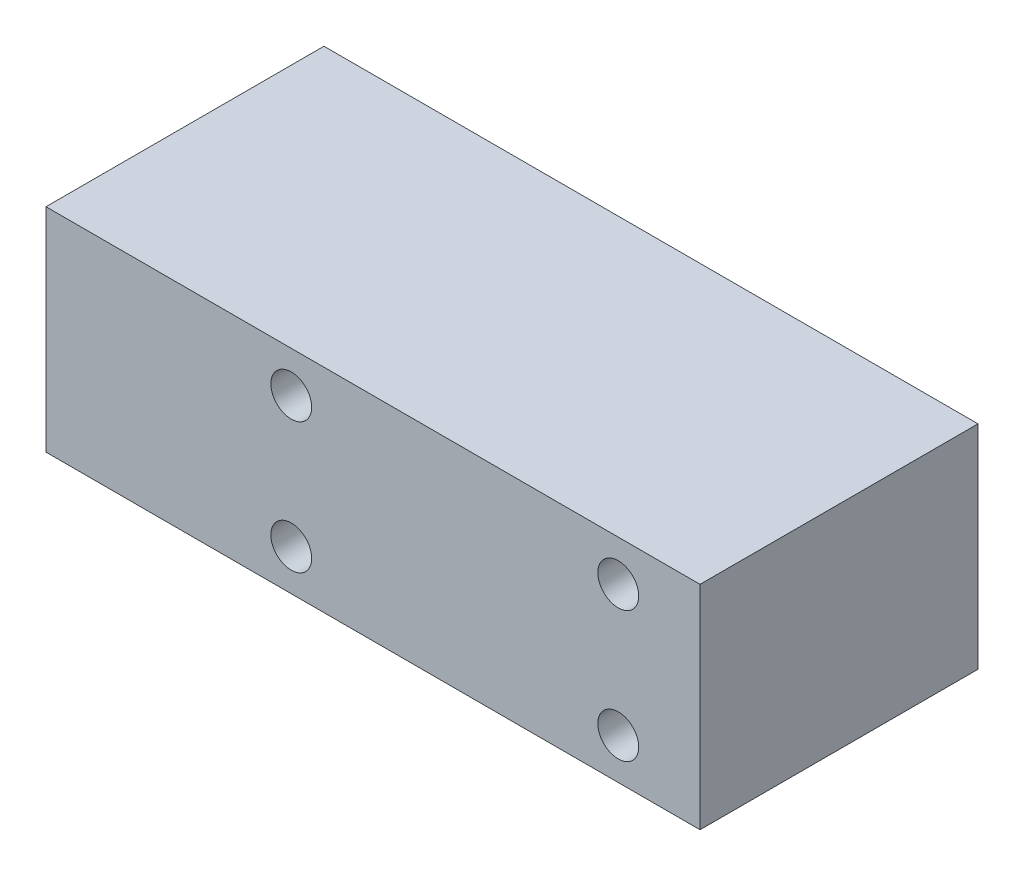
ISO-10303-21;
HEADER;
FILE_DESCRIPTION(('STEP AP214'),'2;1');
FILE_NAME('part.step','',(''),(''),'','','');
FILE_SCHEMA(('AUTOMOTIVE_DESIGN { 1 0 10303 214 1 1 1 1 }'));
ENDSEC;
DATA;
#1=APPLICATION_CONTEXT('core data for automotive mechanical design processes');
#2=APPLICATION_PROTOCOL_DEFINITION('international standard','automotive_design',2000,#1);
#3=PRODUCT_CONTEXT('',#1,'mechanical');
#4=PRODUCT('Part','Part','',(#3));
#5=PRODUCT_RELATED_PRODUCT_CATEGORY('part','',(#4));
#6=PRODUCT_DEFINITION_FORMATION('','',#4);
#7=PRODUCT_DEFINITION_CONTEXT('part definition',#1,'design');
#8=PRODUCT_DEFINITION('design','',#6,#7);
#9=PRODUCT_DEFINITION_SHAPE('','',#8);
#10=(LENGTH_UNIT() NAMED_UNIT(*) SI_UNIT(.MILLI.,.METRE.));
#11=(NAMED_UNIT(*) PLANE_ANGLE_UNIT() SI_UNIT($,.RADIAN.));
#12=(NAMED_UNIT(*) SI_UNIT($,.STERADIAN.) SOLID_ANGLE_UNIT());
#13=UNCERTAINTY_MEASURE_WITH_UNIT(LENGTH_MEASURE(1.E-05),#10,'distance_accuracy_value','');
#14=(GEOMETRIC_REPRESENTATION_CONTEXT(3) GLOBAL_UNCERTAINTY_ASSIGNED_CONTEXT((#13)) GLOBAL_UNIT_ASSIGNED_CONTEXT((#10,
#11,#12)) REPRESENTATION_CONTEXT('',''));
#15=CARTESIAN_POINT('',(0.,0.,0.));
#16=DIRECTION('',(0.,0.,1.));
#17=DIRECTION('',(1.,0.,0.));
#18=AXIS2_PLACEMENT_3D('',#15,#16,#17);
#19=CARTESIAN_POINT('',(0.,0.,34.));
#20=DIRECTION('',(1.,0.,0.));
#21=DIRECTION('',(0.,0.,-1.));
#22=AXIS2_PLACEMENT_3D('',#19,#20,#21);
#23=PLANE('',#22);
#24=DIRECTION('',(0.,-1.,0.));
#25=VECTOR('',#24,1.);
#26=CARTESIAN_POINT('',(0.,0.,0.));
#27=LINE('',#26,#25);
#28=CARTESIAN_POINT('',(0.,26.,0.));
#29=VERTEX_POINT('',#28);
#30=CARTESIAN_POINT('',(0.,0.,0.));
#31=VERTEX_POINT('',#30);
#32=EDGE_CURVE('E164',#29,#31,#27,.T.);
#33=ORIENTED_EDGE('',*,*,#32,.T.);
#34=DIRECTION('',(0.,0.,-1.));
#35=VECTOR('',#34,1.);
#36=CARTESIAN_POINT('',(0.,0.,34.));
#37=LINE('',#36,#35);
#38=CARTESIAN_POINT('',(0.,0.,34.));
#39=VERTEX_POINT('',#38);
#40=EDGE_CURVE('E11',#39,#31,#37,.T.);
#41=ORIENTED_EDGE('',*,*,#40,.F.);
#42=DIRECTION('',(0.,-1.,0.));
#43=VECTOR('',#42,1.);
#44=CARTESIAN_POINT('',(0.,0.,34.));
#45=LINE('',#44,#43);
#46=CARTESIAN_POINT('',(0.,26.,34.));
#47=VERTEX_POINT('',#46);
#48=EDGE_CURVE('E165',#47,#39,#45,.T.);
#49=ORIENTED_EDGE('',*,*,#48,.F.);
#50=DIRECTION('',(0.,0.,-1.));
#51=VECTOR('',#50,1.);
#52=CARTESIAN_POINT('',(0.,26.,34.));
#53=LINE('',#52,#51);
#54=EDGE_CURVE('E171',#47,#29,#53,.T.);
#55=ORIENTED_EDGE('',*,*,#54,.T.);
#56=EDGE_LOOP('',(#33,#41,#49,#55));
#57=FACE_BOUND('',#56,.T.);
#58=ADVANCED_FACE('F35',(#57),#23,.F.);
#59=CARTESIAN_POINT('',(0.,0.,34.));
#60=DIRECTION('',(0.,1.,0.));
#61=DIRECTION('',(0.,0.,1.));
#62=AXIS2_PLACEMENT_3D('',#59,#60,#61);
#63=PLANE('',#62);
#64=DIRECTION('',(1.,0.,0.));
#65=VECTOR('',#64,1.);
#66=CARTESIAN_POINT('',(0.,0.,0.));
#67=LINE('',#66,#65);
#68=CARTESIAN_POINT('',(80.,0.,0.));
#69=VERTEX_POINT('',#68);
#70=EDGE_CURVE('E174',#31,#69,#67,.T.);
#71=ORIENTED_EDGE('',*,*,#70,.T.);
#72=DIRECTION('',(0.,0.,-1.));
#73=VECTOR('',#72,1.);
#74=CARTESIAN_POINT('',(80.,0.,34.));
#75=LINE('',#74,#73);
#76=CARTESIAN_POINT('',(80.,0.,34.));
#77=VERTEX_POINT('',#76);
#78=EDGE_CURVE('E43',#77,#69,#75,.T.);
#79=ORIENTED_EDGE('',*,*,#78,.F.);
#80=DIRECTION('',(1.,0.,0.));
#81=VECTOR('',#80,1.);
#82=CARTESIAN_POINT('',(0.,0.,34.));
#83=LINE('',#82,#81);
#84=EDGE_CURVE('E82',#39,#77,#83,.T.);
#85=ORIENTED_EDGE('',*,*,#84,.F.);
#86=ORIENTED_EDGE('',*,*,#40,.T.);
#87=EDGE_LOOP('',(#71,#79,#85,#86));
#88=FACE_BOUND('',#87,.T.);
#89=ADVANCED_FACE('F198',(#88),#63,.F.);
#90=CARTESIAN_POINT('',(80.,0.,34.));
#91=DIRECTION('',(-1.,0.,0.));
#92=DIRECTION('',(0.,0.,1.));
#93=AXIS2_PLACEMENT_3D('',#90,#91,#92);
#94=PLANE('',#93);
#95=DIRECTION('',(0.,1.,0.));
#96=VECTOR('',#95,1.);
#97=CARTESIAN_POINT('',(80.,0.,0.));
#98=LINE('',#97,#96);
#99=CARTESIAN_POINT('',(80.,26.,0.));
#100=VERTEX_POINT('',#99);
#101=EDGE_CURVE('E69',#69,#100,#98,.T.);
#102=ORIENTED_EDGE('',*,*,#101,.T.);
#103=DIRECTION('',(0.,0.,-1.));
#104=VECTOR('',#103,1.);
#105=CARTESIAN_POINT('',(80.,26.,34.));
#106=LINE('',#105,#104);
#107=CARTESIAN_POINT('',(80.,26.,34.));
#108=VERTEX_POINT('',#107);
#109=EDGE_CURVE('E179',#108,#100,#106,.T.);
#110=ORIENTED_EDGE('',*,*,#109,.F.);
#111=DIRECTION('',(0.,1.,0.));
#112=VECTOR('',#111,1.);
#113=CARTESIAN_POINT('',(80.,0.,34.));
#114=LINE('',#113,#112);
#115=EDGE_CURVE('E168',#77,#108,#114,.T.);
#116=ORIENTED_EDGE('',*,*,#115,.F.);
#117=ORIENTED_EDGE('',*,*,#78,.T.);
#118=EDGE_LOOP('',(#102,#110,#116,#117));
#119=FACE_BOUND('',#118,.T.);
#120=ADVANCED_FACE('F181',(#119),#94,.F.);
#121=CARTESIAN_POINT('',(0.,26.,34.));
#122=DIRECTION('',(0.,-1.,0.));
#123=DIRECTION('',(0.,0.,-1.));
#124=AXIS2_PLACEMENT_3D('',#121,#122,#123);
#125=PLANE('',#124);
#126=DIRECTION('',(-1.,0.,0.));
#127=VECTOR('',#126,1.);
#128=CARTESIAN_POINT('',(0.,26.,0.));
#129=LINE('',#128,#127);
#130=EDGE_CURVE('E75',#100,#29,#129,.T.);
#131=ORIENTED_EDGE('',*,*,#130,.T.);
#132=ORIENTED_EDGE('',*,*,#54,.F.);
#133=DIRECTION('',(-1.,0.,0.));
#134=VECTOR('',#133,1.);
#135=CARTESIAN_POINT('',(0.,26.,34.));
#136=LINE('',#135,#134);
#137=EDGE_CURVE('E51',#108,#47,#136,.T.);
#138=ORIENTED_EDGE('',*,*,#137,.F.);
#139=ORIENTED_EDGE('',*,*,#109,.T.);
#140=EDGE_LOOP('',(#131,#132,#138,#139));
#141=FACE_BOUND('',#140,.T.);
#142=ADVANCED_FACE('F188',(#141),#125,.F.);
#143=CARTESIAN_POINT('',(0.,26.,34.));
#144=DIRECTION('',(0.,0.,-1.));
#145=DIRECTION('',(-1.,0.,0.));
#146=AXIS2_PLACEMENT_3D('',#143,#144,#145);
#147=PLANE('',#146);
#148=CARTESIAN_POINT('',(70.,21.,34.));
#149=DIRECTION('',(0.,0.,1.));
#150=DIRECTION('',(1.,0.,0.));
#151=AXIS2_PLACEMENT_3D('',#148,#149,#150);
#152=CIRCLE('',#151,2.49999999999999);
#153=CARTESIAN_POINT('',(72.5,21.,34.));
#154=VERTEX_POINT('',#153);
#155=EDGE_CURVE('E140',#154,#154,#152,.T.);
#156=ORIENTED_EDGE('',*,*,#155,.F.);
#157=EDGE_LOOP('',(#156));
#158=FACE_BOUND('',#157,.T.);
#159=CARTESIAN_POINT('',(70.,5.,34.));
#160=DIRECTION('',(0.,0.,1.));
#161=DIRECTION('',(1.,0.,0.));
#162=AXIS2_PLACEMENT_3D('',#159,#160,#161);
#163=CIRCLE('',#162,2.49999999999999);
#164=CARTESIAN_POINT('',(72.5,5.,34.));
#165=VERTEX_POINT('',#164);
#166=EDGE_CURVE('E146',#165,#165,#163,.T.);
#167=ORIENTED_EDGE('',*,*,#166,.F.);
#168=EDGE_LOOP('',(#167));
#169=FACE_BOUND('',#168,.T.);
#170=CARTESIAN_POINT('',(30.,21.,34.));
#171=DIRECTION('',(0.,0.,1.));
#172=DIRECTION('',(1.,0.,0.));
#173=AXIS2_PLACEMENT_3D('',#170,#171,#172);
#174=CIRCLE('',#173,2.49999999999999);
#175=CARTESIAN_POINT('',(32.5,21.,34.));
#176=VERTEX_POINT('',#175);
#177=EDGE_CURVE('E152',#176,#176,#174,.T.);
#178=ORIENTED_EDGE('',*,*,#177,.F.);
#179=EDGE_LOOP('',(#178));
#180=FACE_BOUND('',#179,.T.);
#181=CARTESIAN_POINT('',(30.,5.,34.));
#182=DIRECTION('',(0.,0.,1.));
#183=DIRECTION('',(1.,0.,0.));
#184=AXIS2_PLACEMENT_3D('',#181,#182,#183);
#185=CIRCLE('',#184,2.49999999999999);
#186=CARTESIAN_POINT('',(32.5,5.,34.));
#187=VERTEX_POINT('',#186);
#188=EDGE_CURVE('E158',#187,#187,#185,.T.);
#189=ORIENTED_EDGE('',*,*,#188,.F.);
#190=EDGE_LOOP('',(#189));
#191=FACE_BOUND('',#190,.T.);
#192=ORIENTED_EDGE('',*,*,#48,.T.);
#193=ORIENTED_EDGE('',*,*,#84,.T.);
#194=ORIENTED_EDGE('',*,*,#115,.T.);
#195=ORIENTED_EDGE('',*,*,#137,.T.);
#196=EDGE_LOOP('',(#192,#193,#194,#195));
#197=FACE_BOUND('',#196,.T.);
#198=ADVANCED_FACE('F190',(#158,#169,#180,#191,#197),#147,.F.);
#199=CARTESIAN_POINT('',(0.,26.,0.));
#200=DIRECTION('',(0.,0.,-1.));
#201=DIRECTION('',(-1.,0.,0.));
#202=AXIS2_PLACEMENT_3D('',#199,#200,#201);
#203=PLANE('',#202);
#204=CARTESIAN_POINT('',(10.,5.,0.));
#205=DIRECTION('',(0.,0.,-1.));
#206=DIRECTION('',(-1.,0.,0.));
#207=AXIS2_PLACEMENT_3D('',#204,#205,#206);
#208=CIRCLE('',#207,2.49999999999999);
#209=CARTESIAN_POINT('',(7.50000000000002,5.,0.));
#210=VERTEX_POINT('',#209);
#211=EDGE_CURVE('E118',#210,#210,#208,.T.);
#212=ORIENTED_EDGE('',*,*,#211,.F.);
#213=EDGE_LOOP('',(#212));
#214=FACE_BOUND('',#213,.T.);
#215=CARTESIAN_POINT('',(10.,21.,0.));
#216=DIRECTION('',(0.,0.,-1.));
#217=DIRECTION('',(-1.,0.,0.));
#218=AXIS2_PLACEMENT_3D('',#215,#216,#217);
#219=CIRCLE('',#218,2.49999999999999);
#220=CARTESIAN_POINT('',(7.50000000000002,21.,0.));
#221=VERTEX_POINT('',#220);
#222=EDGE_CURVE('E117',#221,#221,#219,.T.);
#223=ORIENTED_EDGE('',*,*,#222,.F.);
#224=EDGE_LOOP('',(#223));
#225=FACE_BOUND('',#224,.T.);
#226=CARTESIAN_POINT('',(70.,21.,0.));
#227=DIRECTION('',(0.,0.,-1.));
#228=DIRECTION('',(-1.,0.,0.));
#229=AXIS2_PLACEMENT_3D('',#226,#227,#228);
#230=CIRCLE('',#229,2.49999999999999);
#231=CARTESIAN_POINT('',(67.5,21.,0.));
#232=VERTEX_POINT('',#231);
#233=EDGE_CURVE('E128',#232,#232,#230,.T.);
#234=ORIENTED_EDGE('',*,*,#233,.F.);
#235=EDGE_LOOP('',(#234));
#236=FACE_BOUND('',#235,.T.);
#237=CARTESIAN_POINT('',(70.,5.,0.));
#238=DIRECTION('',(0.,0.,-1.));
#239=DIRECTION('',(-1.,0.,0.));
#240=AXIS2_PLACEMENT_3D('',#237,#238,#239);
#241=CIRCLE('',#240,2.49999999999999);
#242=CARTESIAN_POINT('',(67.5,5.,0.));
#243=VERTEX_POINT('',#242);
#244=EDGE_CURVE('E134',#243,#243,#241,.T.);
#245=ORIENTED_EDGE('',*,*,#244,.F.);
#246=EDGE_LOOP('',(#245));
#247=FACE_BOUND('',#246,.T.);
#248=ORIENTED_EDGE('',*,*,#32,.F.);
#249=ORIENTED_EDGE('',*,*,#130,.F.);
#250=ORIENTED_EDGE('',*,*,#101,.F.);
#251=ORIENTED_EDGE('',*,*,#70,.F.);
#252=EDGE_LOOP('',(#248,#249,#250,#251));
#253=FACE_BOUND('',#252,.T.);
#254=ADVANCED_FACE('F184',(#214,#225,#236,#247,#253),#203,.T.);
#255=CARTESIAN_POINT('',(30.,5.,19.));
#256=DIRECTION('',(0.,0.,1.));
#257=DIRECTION('',(1.,0.,0.));
#258=AXIS2_PLACEMENT_3D('',#255,#256,#257);
#259=CONICAL_SURFACE('',#258,2.49999999999999,1.02974425867665);
#260=CARTESIAN_POINT('',(30.,5.,17.4978484524311));
#261=VERTEX_POINT('',#260);
#262=VERTEX_LOOP('',#261);
#263=FACE_BOUND('',#262,.T.);
#264=CARTESIAN_POINT('',(30.,5.,19.));
#265=DIRECTION('',(0.,0.,1.));
#266=DIRECTION('',(1.,0.,0.));
#267=AXIS2_PLACEMENT_3D('',#264,#265,#266);
#268=CIRCLE('',#267,2.49999999999999);
#269=CARTESIAN_POINT('',(32.5,5.,19.));
#270=VERTEX_POINT('',#269);
#271=EDGE_CURVE('E161',#270,#270,#268,.T.);
#272=ORIENTED_EDGE('',*,*,#271,.T.);
#273=EDGE_LOOP('',(#272));
#274=FACE_BOUND('',#273,.T.);
#275=ADVANCED_FACE('F228',(#263,#274),#259,.F.);
#276=CARTESIAN_POINT('',(30.,5.,34.));
#277=DIRECTION('',(0.,0.,1.));
#278=DIRECTION('',(1.,0.,0.));
#279=AXIS2_PLACEMENT_3D('',#276,#277,#278);
#280=CYLINDRICAL_SURFACE('',#279,2.49999999999999);
#281=ORIENTED_EDGE('',*,*,#271,.F.);
#282=EDGE_LOOP('',(#281));
#283=FACE_BOUND('',#282,.T.);
#284=ORIENTED_EDGE('',*,*,#188,.T.);
#285=EDGE_LOOP('',(#284));
#286=FACE_BOUND('',#285,.T.);
#287=ADVANCED_FACE('F233',(#283,#286),#280,.F.);
#288=CARTESIAN_POINT('',(30.,21.,19.));
#289=DIRECTION('',(0.,0.,1.));
#290=DIRECTION('',(1.,0.,0.));
#291=AXIS2_PLACEMENT_3D('',#288,#289,#290);
#292=CONICAL_SURFACE('',#291,2.49999999999999,1.02974425867665);
#293=CARTESIAN_POINT('',(30.,21.,17.4978484524311));
#294=VERTEX_POINT('',#293);
#295=VERTEX_LOOP('',#294);
#296=FACE_BOUND('',#295,.T.);
#297=CARTESIAN_POINT('',(30.,21.,19.));
#298=DIRECTION('',(0.,0.,1.));
#299=DIRECTION('',(1.,0.,0.));
#300=AXIS2_PLACEMENT_3D('',#297,#298,#299);
#301=CIRCLE('',#300,2.49999999999999);
#302=CARTESIAN_POINT('',(32.5,21.,19.));
#303=VERTEX_POINT('',#302);
#304=EDGE_CURVE('E155',#303,#303,#301,.T.);
#305=ORIENTED_EDGE('',*,*,#304,.T.);
#306=EDGE_LOOP('',(#305));
#307=FACE_BOUND('',#306,.T.);
#308=ADVANCED_FACE('F244',(#296,#307),#292,.F.);
#309=CARTESIAN_POINT('',(30.,21.,34.));
#310=DIRECTION('',(0.,0.,1.));
#311=DIRECTION('',(1.,0.,0.));
#312=AXIS2_PLACEMENT_3D('',#309,#310,#311);
#313=CYLINDRICAL_SURFACE('',#312,2.49999999999999);
#314=ORIENTED_EDGE('',*,*,#304,.F.);
#315=EDGE_LOOP('',(#314));
#316=FACE_BOUND('',#315,.T.);
#317=ORIENTED_EDGE('',*,*,#177,.T.);
#318=EDGE_LOOP('',(#317));
#319=FACE_BOUND('',#318,.T.);
#320=ADVANCED_FACE('F255',(#316,#319),#313,.F.);
#321=CARTESIAN_POINT('',(70.,5.,19.));
#322=DIRECTION('',(0.,0.,1.));
#323=DIRECTION('',(1.,0.,0.));
#324=AXIS2_PLACEMENT_3D('',#321,#322,#323);
#325=CONICAL_SURFACE('',#324,2.49999999999999,1.02974425867665);
#326=CARTESIAN_POINT('',(70.,5.,17.4978484524311));
#327=VERTEX_POINT('',#326);
#328=VERTEX_LOOP('',#327);
#329=FACE_BOUND('',#328,.T.);
#330=CARTESIAN_POINT('',(70.,5.,19.));
#331=DIRECTION('',(0.,0.,1.));
#332=DIRECTION('',(1.,0.,0.));
#333=AXIS2_PLACEMENT_3D('',#330,#331,#332);
#334=CIRCLE('',#333,2.49999999999999);
#335=CARTESIAN_POINT('',(72.5,5.,19.));
#336=VERTEX_POINT('',#335);
#337=EDGE_CURVE('E149',#336,#336,#334,.T.);
#338=ORIENTED_EDGE('',*,*,#337,.T.);
#339=EDGE_LOOP('',(#338));
#340=FACE_BOUND('',#339,.T.);
#341=ADVANCED_FACE('F265',(#329,#340),#325,.F.);
#342=CARTESIAN_POINT('',(70.,5.,34.));
#343=DIRECTION('',(0.,0.,1.));
#344=DIRECTION('',(1.,0.,0.));
#345=AXIS2_PLACEMENT_3D('',#342,#343,#344);
#346=CYLINDRICAL_SURFACE('',#345,2.49999999999999);
#347=ORIENTED_EDGE('',*,*,#337,.F.);
#348=EDGE_LOOP('',(#347));
#349=FACE_BOUND('',#348,.T.);
#350=ORIENTED_EDGE('',*,*,#166,.T.);
#351=EDGE_LOOP('',(#350));
#352=FACE_BOUND('',#351,.T.);
#353=ADVANCED_FACE('F276',(#349,#352),#346,.F.);
#354=CARTESIAN_POINT('',(70.,21.,19.));
#355=DIRECTION('',(0.,0.,1.));
#356=DIRECTION('',(1.,0.,0.));
#357=AXIS2_PLACEMENT_3D('',#354,#355,#356);
#358=CONICAL_SURFACE('',#357,2.49999999999999,1.02974425867665);
#359=CARTESIAN_POINT('',(70.,21.,17.4978484524311));
#360=VERTEX_POINT('',#359);
#361=VERTEX_LOOP('',#360);
#362=FACE_BOUND('',#361,.T.);
#363=CARTESIAN_POINT('',(70.,21.,19.));
#364=DIRECTION('',(0.,0.,1.));
#365=DIRECTION('',(1.,0.,0.));
#366=AXIS2_PLACEMENT_3D('',#363,#364,#365);
#367=CIRCLE('',#366,2.49999999999999);
#368=CARTESIAN_POINT('',(72.5,21.,19.));
#369=VERTEX_POINT('',#368);
#370=EDGE_CURVE('E143',#369,#369,#367,.T.);
#371=ORIENTED_EDGE('',*,*,#370,.T.);
#372=EDGE_LOOP('',(#371));
#373=FACE_BOUND('',#372,.T.);
#374=ADVANCED_FACE('F286',(#362,#373),#358,.F.);
#375=CARTESIAN_POINT('',(70.,21.,34.));
#376=DIRECTION('',(0.,0.,1.));
#377=DIRECTION('',(1.,0.,0.));
#378=AXIS2_PLACEMENT_3D('',#375,#376,#377);
#379=CYLINDRICAL_SURFACE('',#378,2.49999999999999);
#380=ORIENTED_EDGE('',*,*,#370,.F.);
#381=EDGE_LOOP('',(#380));
#382=FACE_BOUND('',#381,.T.);
#383=ORIENTED_EDGE('',*,*,#155,.T.);
#384=EDGE_LOOP('',(#383));
#385=FACE_BOUND('',#384,.T.);
#386=ADVANCED_FACE('F297',(#382,#385),#379,.F.);
#387=CARTESIAN_POINT('',(70.,5.,15.));
#388=DIRECTION('',(0.,0.,-1.));
#389=DIRECTION('',(-1.,0.,0.));
#390=AXIS2_PLACEMENT_3D('',#387,#388,#389);
#391=CONICAL_SURFACE('',#390,2.5,1.02974425867666);
#392=CARTESIAN_POINT('',(70.,5.,16.5021515475689));
#393=VERTEX_POINT('',#392);
#394=VERTEX_LOOP('',#393);
#395=FACE_BOUND('',#394,.T.);
#396=CARTESIAN_POINT('',(70.,5.,15.));
#397=DIRECTION('',(0.,0.,-1.));
#398=DIRECTION('',(-1.,0.,0.));
#399=AXIS2_PLACEMENT_3D('',#396,#397,#398);
#400=CIRCLE('',#399,2.5);
#401=CARTESIAN_POINT('',(67.5,5.,15.));
#402=VERTEX_POINT('',#401);
#403=EDGE_CURVE('E137',#402,#402,#400,.T.);
#404=ORIENTED_EDGE('',*,*,#403,.T.);
#405=EDGE_LOOP('',(#404));
#406=FACE_BOUND('',#405,.T.);
#407=ADVANCED_FACE('F307',(#395,#406),#391,.F.);
#408=CARTESIAN_POINT('',(70.,5.,0.));
#409=DIRECTION('',(0.,0.,-1.));
#410=DIRECTION('',(-1.,0.,0.));
#411=AXIS2_PLACEMENT_3D('',#408,#409,#410);
#412=CYLINDRICAL_SURFACE('',#411,2.5);
#413=ORIENTED_EDGE('',*,*,#403,.F.);
#414=EDGE_LOOP('',(#413));
#415=FACE_BOUND('',#414,.T.);
#416=ORIENTED_EDGE('',*,*,#244,.T.);
#417=EDGE_LOOP('',(#416));
#418=FACE_BOUND('',#417,.T.);
#419=ADVANCED_FACE('F324',(#415,#418),#412,.F.);
#420=CARTESIAN_POINT('',(70.,21.,15.));
#421=DIRECTION('',(0.,0.,-1.));
#422=DIRECTION('',(-1.,0.,0.));
#423=AXIS2_PLACEMENT_3D('',#420,#421,#422);
#424=CONICAL_SURFACE('',#423,2.5,1.02974425867666);
#425=CARTESIAN_POINT('',(70.,21.,16.5021515475689));
#426=VERTEX_POINT('',#425);
#427=VERTEX_LOOP('',#426);
#428=FACE_BOUND('',#427,.T.);
#429=CARTESIAN_POINT('',(70.,21.,15.));
#430=DIRECTION('',(0.,0.,-1.));
#431=DIRECTION('',(-1.,0.,0.));
#432=AXIS2_PLACEMENT_3D('',#429,#430,#431);
#433=CIRCLE('',#432,2.5);
#434=CARTESIAN_POINT('',(67.5,21.,15.));
#435=VERTEX_POINT('',#434);
#436=EDGE_CURVE('E131',#435,#435,#433,.T.);
#437=ORIENTED_EDGE('',*,*,#436,.T.);
#438=EDGE_LOOP('',(#437));
#439=FACE_BOUND('',#438,.T.);
#440=ADVANCED_FACE('F334',(#428,#439),#424,.F.);
#441=CARTESIAN_POINT('',(70.,21.,0.));
#442=DIRECTION('',(0.,0.,-1.));
#443=DIRECTION('',(-1.,0.,0.));
#444=AXIS2_PLACEMENT_3D('',#441,#442,#443);
#445=CYLINDRICAL_SURFACE('',#444,2.5);
#446=ORIENTED_EDGE('',*,*,#436,.F.);
#447=EDGE_LOOP('',(#446));
#448=FACE_BOUND('',#447,.T.);
#449=ORIENTED_EDGE('',*,*,#233,.T.);
#450=EDGE_LOOP('',(#449));
#451=FACE_BOUND('',#450,.T.);
#452=ADVANCED_FACE('F345',(#448,#451),#445,.F.);
#453=CARTESIAN_POINT('',(10.,21.,15.));
#454=DIRECTION('',(0.,0.,-1.));
#455=DIRECTION('',(-1.,0.,0.));
#456=AXIS2_PLACEMENT_3D('',#453,#454,#455);
#457=CONICAL_SURFACE('',#456,2.5,1.02974425867665);
#458=CARTESIAN_POINT('',(10.,21.,16.5021515475689));
#459=VERTEX_POINT('',#458);
#460=VERTEX_LOOP('',#459);
#461=FACE_BOUND('',#460,.T.);
#462=CARTESIAN_POINT('',(10.,21.,15.));
#463=DIRECTION('',(0.,0.,-1.));
#464=DIRECTION('',(-1.,0.,0.));
#465=AXIS2_PLACEMENT_3D('',#462,#463,#464);
#466=CIRCLE('',#465,2.5);
#467=CARTESIAN_POINT('',(7.50000000000001,21.,15.));
#468=VERTEX_POINT('',#467);
#469=EDGE_CURVE('E121',#468,#468,#466,.T.);
#470=ORIENTED_EDGE('',*,*,#469,.T.);
#471=EDGE_LOOP('',(#470));
#472=FACE_BOUND('',#471,.T.);
#473=ADVANCED_FACE('F355',(#461,#472),#457,.F.);
#474=CARTESIAN_POINT('',(10.,21.,0.));
#475=DIRECTION('',(0.,0.,-1.));
#476=DIRECTION('',(-1.,0.,0.));
#477=AXIS2_PLACEMENT_3D('',#474,#475,#476);
#478=CYLINDRICAL_SURFACE('',#477,2.49999999999999);
#479=ORIENTED_EDGE('',*,*,#469,.F.);
#480=EDGE_LOOP('',(#479));
#481=FACE_BOUND('',#480,.T.);
#482=ORIENTED_EDGE('',*,*,#222,.T.);
#483=EDGE_LOOP('',(#482));
#484=FACE_BOUND('',#483,.T.);
#485=ADVANCED_FACE('F111',(#481,#484),#478,.F.);
#486=CARTESIAN_POINT('',(10.,5.,15.));
#487=DIRECTION('',(0.,0.,-1.));
#488=DIRECTION('',(-1.,0.,0.));
#489=AXIS2_PLACEMENT_3D('',#486,#487,#488);
#490=CONICAL_SURFACE('',#489,2.5,1.02974425867665);
#491=CARTESIAN_POINT('',(10.,5.,16.5021515475689));
#492=VERTEX_POINT('',#491);
#493=VERTEX_LOOP('',#492);
#494=FACE_BOUND('',#493,.T.);
#495=CARTESIAN_POINT('',(10.,5.,15.));
#496=DIRECTION('',(0.,0.,-1.));
#497=DIRECTION('',(-1.,0.,0.));
#498=AXIS2_PLACEMENT_3D('',#495,#496,#497);
#499=CIRCLE('',#498,2.5);
#500=CARTESIAN_POINT('',(7.50000000000001,5.,15.));
#501=VERTEX_POINT('',#500);
#502=EDGE_CURVE('E115',#501,#501,#499,.T.);
#503=ORIENTED_EDGE('',*,*,#502,.T.);
#504=EDGE_LOOP('',(#503));
#505=FACE_BOUND('',#504,.T.);
#506=ADVANCED_FACE('F107',(#494,#505),#490,.F.);
#507=CARTESIAN_POINT('',(10.,5.,0.));
#508=DIRECTION('',(0.,0.,-1.));
#509=DIRECTION('',(-1.,0.,0.));
#510=AXIS2_PLACEMENT_3D('',#507,#508,#509);
#511=CYLINDRICAL_SURFACE('',#510,2.49999999999999);
#512=ORIENTED_EDGE('',*,*,#502,.F.);
#513=EDGE_LOOP('',(#512));
#514=FACE_BOUND('',#513,.T.);
#515=ORIENTED_EDGE('',*,*,#211,.T.);
#516=EDGE_LOOP('',(#515));
#517=FACE_BOUND('',#516,.T.);
#518=ADVANCED_FACE('F110',(#514,#517),#511,.F.);
#519=CLOSED_SHELL('',(#58,#89,#120,#142,#198,#254,#275,#287,#308,#320,#341,#353,#374,#386,#407,
#419,#440,#452,#473,#485,#506,#518));
#520=MANIFOLD_SOLID_BREP('B2',#519);
#521=ADVANCED_BREP_SHAPE_REPRESENTATION('',(#18,#520),#14);
#522=SHAPE_DEFINITION_REPRESENTATION(#9,#521);
ENDSEC;
END-ISO-10303-21;
